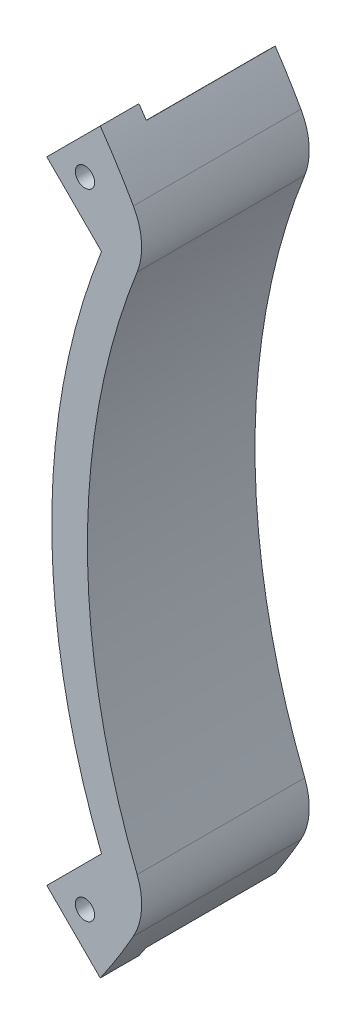
ISO-10303-21;
HEADER;
FILE_DESCRIPTION(('STEP AP214'),'2;1');
FILE_NAME('part.step','',(''),(''),'','','');
FILE_SCHEMA(('AUTOMOTIVE_DESIGN { 1 0 10303 214 1 1 1 1 }'));
ENDSEC;
DATA;
#1=APPLICATION_CONTEXT('core data for automotive mechanical design processes');
#2=APPLICATION_PROTOCOL_DEFINITION('international standard','automotive_design',2000,#1);
#3=PRODUCT_CONTEXT('',#1,'mechanical');
#4=PRODUCT('Part','Part','',(#3));
#5=PRODUCT_RELATED_PRODUCT_CATEGORY('part','',(#4));
#6=PRODUCT_DEFINITION_FORMATION('','',#4);
#7=PRODUCT_DEFINITION_CONTEXT('part definition',#1,'design');
#8=PRODUCT_DEFINITION('design','',#6,#7);
#9=PRODUCT_DEFINITION_SHAPE('','',#8);
#10=(LENGTH_UNIT() NAMED_UNIT(*) SI_UNIT(.MILLI.,.METRE.));
#11=(NAMED_UNIT(*) PLANE_ANGLE_UNIT() SI_UNIT($,.RADIAN.));
#12=(NAMED_UNIT(*) SI_UNIT($,.STERADIAN.) SOLID_ANGLE_UNIT());
#13=UNCERTAINTY_MEASURE_WITH_UNIT(LENGTH_MEASURE(1.E-05),#10,'distance_accuracy_value','');
#14=(GEOMETRIC_REPRESENTATION_CONTEXT(3) GLOBAL_UNCERTAINTY_ASSIGNED_CONTEXT((#13)) GLOBAL_UNIT_ASSIGNED_CONTEXT((#10,
#11,#12)) REPRESENTATION_CONTEXT('',''));
#15=CARTESIAN_POINT('',(0.,0.,0.));
#16=DIRECTION('',(0.,0.,1.));
#17=DIRECTION('',(1.,0.,0.));
#18=AXIS2_PLACEMENT_3D('',#15,#16,#17);
#19=CARTESIAN_POINT('',(175.870830597952,0.,-23.));
#20=DIRECTION('',(0.,0.,1.));
#21=DIRECTION('',(1.,0.,0.));
#22=AXIS2_PLACEMENT_3D('',#19,#20,#21);
#23=CYLINDRICAL_SURFACE('',#22,101.398788204074);
#24=DIRECTION('',(0.,0.,1.));
#25=VECTOR('',#24,1.);
#26=CARTESIAN_POINT('',(86.4700479418291,47.8457344987754,-23.));
#27=LINE('',#26,#25);
#28=CARTESIAN_POINT('',(86.4700479418291,47.8457344987754,-23.));
#29=VERTEX_POINT('',#28);
#30=CARTESIAN_POINT('',(86.4700479418291,47.8457344987754,0.));
#31=VERTEX_POINT('',#30);
#32=EDGE_CURVE('E209',#29,#31,#27,.T.);
#33=ORIENTED_EDGE('',*,*,#32,.F.);
#34=CARTESIAN_POINT('',(175.870830597952,0.,-23.));
#35=DIRECTION('',(0.,0.,-1.));
#36=DIRECTION('',(1.,0.,0.));
#37=AXIS2_PLACEMENT_3D('',#34,#35,#36);
#38=CIRCLE('',#37,101.398788204074);
#39=CARTESIAN_POINT('',(86.4700479418276,-47.8457344987727,-23.));
#40=VERTEX_POINT('',#39);
#41=EDGE_CURVE('E272',#40,#29,#38,.T.);
#42=ORIENTED_EDGE('',*,*,#41,.F.);
#43=DIRECTION('',(0.,0.,1.));
#44=VECTOR('',#43,1.);
#45=CARTESIAN_POINT('',(86.4700479418291,-47.8457344987754,-23.));
#46=LINE('',#45,#44);
#47=CARTESIAN_POINT('',(86.4700479418291,-47.8457344987754,0.));
#48=VERTEX_POINT('',#47);
#49=EDGE_CURVE('E227',#40,#48,#46,.T.);
#50=ORIENTED_EDGE('',*,*,#49,.T.);
#51=CARTESIAN_POINT('',(175.870830597952,0.,0.));
#52=DIRECTION('',(0.,0.,-1.));
#53=DIRECTION('',(1.,0.,0.));
#54=AXIS2_PLACEMENT_3D('',#51,#52,#53);
#55=CIRCLE('',#54,101.398788204074);
#56=CARTESIAN_POINT('',(74.4720423938781,9.73033553650936E-11,0.));
#57=VERTEX_POINT('',#56);
#58=EDGE_CURVE('E226',#48,#57,#55,.T.);
#59=ORIENTED_EDGE('',*,*,#58,.T.);
#60=EDGE_CURVE('E11',#57,#31,#55,.T.);
#61=ORIENTED_EDGE('',*,*,#60,.T.);
#62=EDGE_LOOP('',(#33,#42,#50,#59,#61));
#63=FACE_BOUND('',#62,.T.);
#64=ADVANCED_FACE('F35',(#63),#23,.T.);
#65=CARTESIAN_POINT('',(134.210526315791,22.0801862772663,-23.));
#66=DIRECTION('',(0.,0.,-1.));
#67=DIRECTION('',(-1.,0.,0.));
#68=AXIS2_PLACEMENT_3D('',#65,#66,#67);
#69=PLANE('',#68);
#70=DIRECTION('',(0.700426807828458,-0.71372423727602,0.));
#71=VECTOR('',#70,1.);
#72=CARTESIAN_POINT('',(83.1207639065787,-55.596210370733,-23.));
#73=LINE('',#72,#71);
#74=CARTESIAN_POINT('',(81.7680047254731,-54.217769391659,-23.));
#75=VERTEX_POINT('',#74);
#76=CARTESIAN_POINT('',(83.1207639065787,-55.596210370733,-23.));
#77=VERTEX_POINT('',#76);
#78=EDGE_CURVE('E200',#75,#77,#73,.T.);
#79=ORIENTED_EDGE('',*,*,#78,.F.);
#80=DIRECTION('',(0.593760298507402,0.804641974990369,0.));
#81=VECTOR('',#80,1.);
#82=CARTESIAN_POINT('',(80.5784912959711,-55.8297539544509,-23.));
#83=LINE('',#82,#81);
#84=EDGE_CURVE('E183',#75,#40,#83,.T.);
#85=ORIENTED_EDGE('',*,*,#84,.T.);
#86=ORIENTED_EDGE('',*,*,#41,.T.);
#87=DIRECTION('',(-0.593760298508029,0.804641974989906,0.));
#88=VECTOR('',#87,1.);
#89=CARTESIAN_POINT('',(80.5784912959711,55.8297539544379,-23.));
#90=LINE('',#89,#88);
#91=CARTESIAN_POINT('',(81.7680047254731,54.2177693916496,-23.));
#92=VERTEX_POINT('',#91);
#93=EDGE_CURVE('E210',#29,#92,#90,.T.);
#94=ORIENTED_EDGE('',*,*,#93,.T.);
#95=DIRECTION('',(-0.713724237276011,-0.700426807828467,0.));
#96=VECTOR('',#95,1.);
#97=CARTESIAN_POINT('',(81.7680047254731,54.2177693916496,-23.));
#98=LINE('',#97,#96);
#99=CARTESIAN_POINT('',(83.1413065624282,55.565485178232,-23.));
#100=VERTEX_POINT('',#99);
#101=EDGE_CURVE('E191',#100,#92,#98,.T.);
#102=ORIENTED_EDGE('',*,*,#101,.F.);
#103=CARTESIAN_POINT('',(-9.12325770485722E-11,-5.72528136011385E-11,-23.));
#104=DIRECTION('',(0.,0.,-1.));
#105=DIRECTION('',(-1.,0.,0.));
#106=AXIS2_PLACEMENT_3D('',#103,#104,#105);
#107=CIRCLE('',#106,100.000000000108);
#108=CARTESIAN_POINT('',(87.1345029239766,49.0670806161475,-23.));
#109=VERTEX_POINT('',#108);
#110=EDGE_CURVE('E39',#100,#109,#107,.T.);
#111=ORIENTED_EDGE('',*,*,#110,.T.);
#112=CARTESIAN_POINT('',(78.4210526315789,44.1603725545327,-23.));
#113=DIRECTION('',(0.,0.,-1.));
#114=DIRECTION('',(-1.,0.,0.));
#115=AXIS2_PLACEMENT_3D('',#112,#113,#114);
#116=CIRCLE('',#115,10.);
#117=CARTESIAN_POINT('',(87.719298245614,40.4803415083216,-23.));
#118=VERTEX_POINT('',#117);
#119=EDGE_CURVE('E247',#109,#118,#116,.T.);
#120=ORIENTED_EDGE('',*,*,#119,.T.);
#121=CARTESIAN_POINT('',(190.000000000003,0.,-23.));
#122=DIRECTION('',(0.,0.,1.));
#123=DIRECTION('',(-1.,0.,0.));
#124=AXIS2_PLACEMENT_3D('',#121,#122,#123);
#125=CIRCLE('',#124,110.000000000002);
#126=CARTESIAN_POINT('',(87.719298245614,-40.4803415083217,-23.));
#127=VERTEX_POINT('',#126);
#128=EDGE_CURVE('E242',#118,#127,#125,.T.);
#129=ORIENTED_EDGE('',*,*,#128,.T.);
#130=CARTESIAN_POINT('',(78.421052631579,-44.1603725545327,-23.));
#131=DIRECTION('',(0.,0.,-1.));
#132=DIRECTION('',(-1.,0.,0.));
#133=AXIS2_PLACEMENT_3D('',#130,#131,#132);
#134=CIRCLE('',#133,9.99999999999997);
#135=CARTESIAN_POINT('',(87.1345029239766,-49.0670806161475,-23.));
#136=VERTEX_POINT('',#135);
#137=EDGE_CURVE('E269',#127,#136,#134,.T.);
#138=ORIENTED_EDGE('',*,*,#137,.T.);
#139=CARTESIAN_POINT('',(-6.06875660835726E-11,3.8143099789778E-11,-23.));
#140=DIRECTION('',(0.,0.,-1.));
#141=DIRECTION('',(-1.,0.,0.));
#142=AXIS2_PLACEMENT_3D('',#139,#140,#141);
#143=CIRCLE('',#142,100.000000000072);
#144=EDGE_CURVE('E229',#136,#77,#143,.T.);
#145=ORIENTED_EDGE('',*,*,#144,.T.);
#146=EDGE_LOOP('',(#79,#85,#86,#94,#102,#111,#120,#129,#138,#145));
#147=FACE_BOUND('',#146,.T.);
#148=ADVANCED_FACE('F393',(#147),#69,.T.);
#149=CARTESIAN_POINT('',(0.,0.,0.));
#150=DIRECTION('',(0.,0.,1.));
#151=DIRECTION('',(1.,0.,0.));
#152=AXIS2_PLACEMENT_3D('',#149,#150,#151);
#153=PLANE('',#152);
#154=CARTESIAN_POINT('',(79.6200140237975,49.2144224327723,0.));
#155=DIRECTION('',(0.,0.,-1.));
#156=DIRECTION('',(-1.,0.,0.));
#157=AXIS2_PLACEMENT_3D('',#154,#155,#156);
#158=CIRCLE('',#157,1.5);
#159=CARTESIAN_POINT('',(78.1200140237975,49.2144224327723,0.));
#160=VERTEX_POINT('',#159);
#161=EDGE_CURVE('E275',#160,#160,#158,.T.);
#162=ORIENTED_EDGE('',*,*,#161,.F.);
#163=EDGE_LOOP('',(#162));
#164=FACE_BOUND('',#163,.T.);
#165=DIRECTION('',(-0.593760298508029,0.804641974989906,0.));
#166=VECTOR('',#165,1.);
#167=CARTESIAN_POINT('',(80.5784912959711,55.8297539544379,0.));
#168=LINE('',#167,#166);
#169=CARTESIAN_POINT('',(80.5784912959711,55.8297539544379,0.));
#170=VERTEX_POINT('',#169);
#171=EDGE_CURVE('E206',#31,#170,#168,.T.);
#172=ORIENTED_EDGE('',*,*,#171,.F.);
#173=ORIENTED_EDGE('',*,*,#60,.F.);
#174=CARTESIAN_POINT('',(184.472042393878,-8.25381429869765E-12,0.));
#175=DIRECTION('',(0.,0.,1.));
#176=DIRECTION('',(1.,0.,0.));
#177=AXIS2_PLACEMENT_3D('',#174,#175,#176);
#178=CIRCLE('',#177,110.);
#179=CARTESIAN_POINT('',(82.1859051286103,40.466605038601,0.));
#180=VERTEX_POINT('',#179);
#181=EDGE_CURVE('E287',#180,#57,#178,.T.);
#182=ORIENTED_EDGE('',*,*,#181,.F.);
#183=DIRECTION('',(0.707106781186502,-0.707106781186594,0.));
#184=VECTOR('',#183,1.);
#185=CARTESIAN_POINT('',(61.326255083611,61.326255083603,0.));
#186=LINE('',#185,#184);
#187=CARTESIAN_POINT('',(73.7006237543726,48.9518864128398,0.));
#188=VERTEX_POINT('',#187);
#189=EDGE_CURVE('E290',#188,#180,#186,.T.);
#190=ORIENTED_EDGE('',*,*,#189,.F.);
#191=DIRECTION('',(0.707106781186568,0.707106781186527,0.));
#192=VECTOR('',#191,1.);
#193=CARTESIAN_POINT('',(12.3743686707643,-12.374368670765,0.));
#194=LINE('',#193,#192);
#195=EDGE_CURVE('E339',#188,#170,#194,.T.);
#196=ORIENTED_EDGE('',*,*,#195,.T.);
#197=EDGE_LOOP('',(#172,#173,#182,#190,#196));
#198=FACE_BOUND('',#197,.T.);
#199=ADVANCED_FACE('F406',(#164,#198),#153,.F.);
#200=CARTESIAN_POINT('',(79.6191075128986,-49.2135159218862,0.));
#201=DIRECTION('',(0.,0.,-1.));
#202=DIRECTION('',(-1.,0.,0.));
#203=AXIS2_PLACEMENT_3D('',#200,#201,#202);
#204=CIRCLE('',#203,1.5);
#205=CARTESIAN_POINT('',(78.1191075128986,-49.2135159218862,0.));
#206=VERTEX_POINT('',#205);
#207=EDGE_CURVE('E284',#206,#206,#204,.T.);
#208=ORIENTED_EDGE('',*,*,#207,.F.);
#209=EDGE_LOOP('',(#208));
#210=FACE_BOUND('',#209,.T.);
#211=DIRECTION('',(0.593760298507402,0.804641974990369,0.));
#212=VECTOR('',#211,1.);
#213=CARTESIAN_POINT('',(80.5784912959711,-55.8297539544509,0.));
#214=LINE('',#213,#212);
#215=CARTESIAN_POINT('',(80.5784912959711,-55.8297539544509,0.));
#216=VERTEX_POINT('',#215);
#217=EDGE_CURVE('E212',#216,#48,#214,.T.);
#218=ORIENTED_EDGE('',*,*,#217,.F.);
#219=DIRECTION('',(-0.707106781186501,0.707106781186594,0.));
#220=VECTOR('',#219,1.);
#221=CARTESIAN_POINT('',(12.3743686707654,12.3743686707638,0.));
#222=LINE('',#221,#220);
#223=CARTESIAN_POINT('',(73.7006237543677,-48.9518864128466,0.));
#224=VERTEX_POINT('',#223);
#225=EDGE_CURVE('E45',#216,#224,#222,.T.);
#226=ORIENTED_EDGE('',*,*,#225,.T.);
#227=DIRECTION('',(0.707106781186594,0.707106781186501,0.));
#228=VECTOR('',#227,1.);
#229=CARTESIAN_POINT('',(61.3262550836023,-61.3262550836104,0.));
#230=LINE('',#229,#228);
#231=CARTESIAN_POINT('',(82.1859051286068,-40.4666050386086,0.));
#232=VERTEX_POINT('',#231);
#233=EDGE_CURVE('E293',#224,#232,#230,.T.);
#234=ORIENTED_EDGE('',*,*,#233,.T.);
#235=EDGE_CURVE('E291',#57,#232,#178,.T.);
#236=ORIENTED_EDGE('',*,*,#235,.F.);
#237=ORIENTED_EDGE('',*,*,#58,.F.);
#238=EDGE_LOOP('',(#218,#226,#234,#236,#237));
#239=FACE_BOUND('',#238,.T.);
#240=ADVANCED_FACE('F411',(#210,#239),#153,.F.);
#241=CARTESIAN_POINT('',(83.0850467894215,58.3363094478882,-7.));
#242=DIRECTION('',(0.707106781186527,-0.707106781186568,0.));
#243=DIRECTION('',(0.707106781186568,0.707106781186527,0.));
#244=AXIS2_PLACEMENT_3D('',#241,#242,#243);
#245=PLANE('',#244);
#246=DIRECTION('',(0.,0.,-1.));
#247=VECTOR('',#246,1.);
#248=CARTESIAN_POINT('',(81.9938702489879,57.2451329074546,3.));
#249=LINE('',#248,#247);
#250=CARTESIAN_POINT('',(81.9938702489879,57.2451329074546,-3.));
#251=VERTEX_POINT('',#250);
#252=CARTESIAN_POINT('',(81.9938702489879,57.2451329074546,3.));
#253=VERTEX_POINT('',#252);
#254=EDGE_CURVE('E320',#251,#253,#249,.F.);
#255=ORIENTED_EDGE('',*,*,#254,.F.);
#256=DIRECTION('',(0.707106781186568,0.707106781186527,0.));
#257=VECTOR('',#256,1.);
#258=CARTESIAN_POINT('',(80.5784912959711,55.8297539544379,-3.));
#259=LINE('',#258,#257);
#260=CARTESIAN_POINT('',(80.5784912959711,55.8297539544379,-3.));
#261=VERTEX_POINT('',#260);
#262=EDGE_CURVE('E189',#261,#251,#259,.T.);
#263=ORIENTED_EDGE('',*,*,#262,.F.);
#264=DIRECTION('',(0.,0.,1.));
#265=VECTOR('',#264,1.);
#266=CARTESIAN_POINT('',(80.5784912959711,55.8297539544379,-23.));
#267=LINE('',#266,#265);
#268=EDGE_CURVE('E207',#261,#170,#267,.T.);
#269=ORIENTED_EDGE('',*,*,#268,.T.);
#270=ORIENTED_EDGE('',*,*,#195,.F.);
#271=DIRECTION('',(0.,0.,1.));
#272=VECTOR('',#271,1.);
#273=CARTESIAN_POINT('',(73.7006237543726,48.9518864128398,0.));
#274=LINE('',#273,#272);
#275=CARTESIAN_POINT('',(73.7006237543726,48.9518864128398,3.));
#276=VERTEX_POINT('',#275);
#277=EDGE_CURVE('E311',#188,#276,#274,.T.);
#278=ORIENTED_EDGE('',*,*,#277,.T.);
#279=DIRECTION('',(0.707106781186568,0.707106781186527,0.));
#280=VECTOR('',#279,1.);
#281=CARTESIAN_POINT('',(83.0850467894215,58.3363094478882,3.));
#282=LINE('',#281,#280);
#283=EDGE_CURVE('E308',#276,#253,#282,.T.);
#284=ORIENTED_EDGE('',*,*,#283,.T.);
#285=EDGE_LOOP('',(#255,#263,#269,#270,#278,#284));
#286=FACE_BOUND('',#285,.T.);
#287=ADVANCED_FACE('F374',(#286),#245,.F.);
#288=CARTESIAN_POINT('',(0.,0.,3.));
#289=DIRECTION('',(0.,0.,-1.));
#290=DIRECTION('',(-1.,0.,0.));
#291=AXIS2_PLACEMENT_3D('',#288,#289,#290);
#292=CYLINDRICAL_SURFACE('',#291,100.);
#293=CARTESIAN_POINT('',(0.,0.,-3.));
#294=DIRECTION('',(0.,0.,1.));
#295=DIRECTION('',(1.,0.,0.));
#296=AXIS2_PLACEMENT_3D('',#293,#294,#295);
#297=CIRCLE('',#296,100.);
#298=CARTESIAN_POINT('',(81.9938702489824,-57.2451329074624,-3.));
#299=VERTEX_POINT('',#298);
#300=CARTESIAN_POINT('',(83.1207639065787,-55.596210370733,-3.));
#301=VERTEX_POINT('',#300);
#302=EDGE_CURVE('E204',#299,#301,#297,.T.);
#303=ORIENTED_EDGE('',*,*,#302,.T.);
#304=DIRECTION('',(0.,0.,-1.));
#305=VECTOR('',#304,1.);
#306=CARTESIAN_POINT('',(83.1207639065787,-55.596210370733,-3.));
#307=LINE('',#306,#305);
#308=EDGE_CURVE('E172',#301,#77,#307,.T.);
#309=ORIENTED_EDGE('',*,*,#308,.T.);
#310=ORIENTED_EDGE('',*,*,#144,.F.);
#311=DIRECTION('',(0.,0.,-1.));
#312=VECTOR('',#311,1.);
#313=CARTESIAN_POINT('',(87.1345029239766,-49.0670806161475,3.));
#314=LINE('',#313,#312);
#315=CARTESIAN_POINT('',(87.1345029239766,-49.0670806161475,3.));
#316=VERTEX_POINT('',#315);
#317=EDGE_CURVE('E254',#136,#316,#314,.F.);
#318=ORIENTED_EDGE('',*,*,#317,.T.);
#319=CARTESIAN_POINT('',(0.,0.,3.));
#320=DIRECTION('',(0.,0.,1.));
#321=DIRECTION('',(1.,0.,0.));
#322=AXIS2_PLACEMENT_3D('',#319,#320,#321);
#323=CIRCLE('',#322,100.);
#324=CARTESIAN_POINT('',(81.9938702489824,-57.2451329074624,3.));
#325=VERTEX_POINT('',#324);
#326=EDGE_CURVE('E328',#325,#316,#323,.T.);
#327=ORIENTED_EDGE('',*,*,#326,.F.);
#328=DIRECTION('',(0.,0.,-1.));
#329=VECTOR('',#328,1.);
#330=CARTESIAN_POINT('',(81.9938702489824,-57.2451329074624,3.));
#331=LINE('',#330,#329);
#332=EDGE_CURVE('E322',#325,#299,#331,.T.);
#333=ORIENTED_EDGE('',*,*,#332,.T.);
#334=EDGE_LOOP('',(#303,#309,#310,#318,#327,#333));
#335=FACE_BOUND('',#334,.T.);
#336=ADVANCED_FACE('F346',(#335),#292,.T.);
#337=ORIENTED_EDGE('',*,*,#110,.F.);
#338=DIRECTION('',(0.,0.,-1.));
#339=VECTOR('',#338,1.);
#340=CARTESIAN_POINT('',(83.1413065624282,55.565485178232,-3.));
#341=LINE('',#340,#339);
#342=CARTESIAN_POINT('',(83.1413065624282,55.565485178232,-3.));
#343=VERTEX_POINT('',#342);
#344=EDGE_CURVE('E195',#343,#100,#341,.T.);
#345=ORIENTED_EDGE('',*,*,#344,.F.);
#346=CARTESIAN_POINT('',(0.,0.,-3.));
#347=DIRECTION('',(0.,0.,1.));
#348=DIRECTION('',(1.,0.,0.));
#349=AXIS2_PLACEMENT_3D('',#346,#347,#348);
#350=CIRCLE('',#349,100.);
#351=EDGE_CURVE('E185',#343,#251,#350,.T.);
#352=ORIENTED_EDGE('',*,*,#351,.T.);
#353=ORIENTED_EDGE('',*,*,#254,.T.);
#354=CARTESIAN_POINT('',(87.1345029239766,49.0670806161475,3.));
#355=VERTEX_POINT('',#354);
#356=EDGE_CURVE('E255',#355,#253,#323,.T.);
#357=ORIENTED_EDGE('',*,*,#356,.F.);
#358=DIRECTION('',(0.,0.,-1.));
#359=VECTOR('',#358,1.);
#360=CARTESIAN_POINT('',(87.1345029239766,49.0670806161475,3.));
#361=LINE('',#360,#359);
#362=EDGE_CURVE('E252',#355,#109,#361,.T.);
#363=ORIENTED_EDGE('',*,*,#362,.T.);
#364=EDGE_LOOP('',(#337,#345,#352,#353,#357,#363));
#365=FACE_BOUND('',#364,.T.);
#366=ADVANCED_FACE('F369',(#365),#292,.T.);
#367=CARTESIAN_POINT('',(0.,0.,3.));
#368=DIRECTION('',(0.,0.,1.));
#369=DIRECTION('',(1.,0.,0.));
#370=AXIS2_PLACEMENT_3D('',#367,#368,#369);
#371=PLANE('',#370);
#372=CARTESIAN_POINT('',(79.6191075128986,-49.2135159218862,3.));
#373=DIRECTION('',(0.,0.,-1.));
#374=DIRECTION('',(-1.,0.,0.));
#375=AXIS2_PLACEMENT_3D('',#372,#373,#374);
#376=CIRCLE('',#375,1.5);
#377=CARTESIAN_POINT('',(78.1191075128986,-49.2135159218862,3.));
#378=VERTEX_POINT('',#377);
#379=EDGE_CURVE('E261',#378,#378,#376,.T.);
#380=ORIENTED_EDGE('',*,*,#379,.T.);
#381=EDGE_LOOP('',(#380));
#382=FACE_BOUND('',#381,.T.);
#383=CARTESIAN_POINT('',(79.6200140237975,49.2144224327723,3.));
#384=DIRECTION('',(0.,0.,-1.));
#385=DIRECTION('',(-1.,0.,0.));
#386=AXIS2_PLACEMENT_3D('',#383,#384,#385);
#387=CIRCLE('',#386,1.5);
#388=CARTESIAN_POINT('',(78.1200140237975,49.2144224327723,3.));
#389=VERTEX_POINT('',#388);
#390=EDGE_CURVE('E279',#389,#389,#387,.T.);
#391=ORIENTED_EDGE('',*,*,#390,.T.);
#392=EDGE_LOOP('',(#391));
#393=FACE_BOUND('',#392,.T.);
#394=DIRECTION('',(0.707106781186594,0.707106781186501,0.));
#395=VECTOR('',#394,1.);
#396=CARTESIAN_POINT('',(61.3262550836023,-61.3262550836104,3.));
#397=LINE('',#396,#395);
#398=CARTESIAN_POINT('',(73.7006237543677,-48.9518864128466,3.));
#399=VERTEX_POINT('',#398);
#400=CARTESIAN_POINT('',(82.1859051286068,-40.4666050386086,3.));
#401=VERTEX_POINT('',#400);
#402=EDGE_CURVE('E303',#399,#401,#397,.T.);
#403=ORIENTED_EDGE('',*,*,#402,.F.);
#404=DIRECTION('',(-0.707106781186501,0.707106781186594,0.));
#405=VECTOR('',#404,1.);
#406=CARTESIAN_POINT('',(83.0850467894155,-58.3363094478957,3.));
#407=LINE('',#406,#405);
#408=EDGE_CURVE('E317',#325,#399,#407,.T.);
#409=ORIENTED_EDGE('',*,*,#408,.F.);
#410=ORIENTED_EDGE('',*,*,#326,.T.);
#411=CARTESIAN_POINT('',(78.4210526315789,-44.1603725545327,3.));
#412=DIRECTION('',(0.,0.,1.));
#413=DIRECTION('',(1.,0.,0.));
#414=AXIS2_PLACEMENT_3D('',#411,#412,#413);
#415=CIRCLE('',#414,10.);
#416=CARTESIAN_POINT('',(87.719298245614,-40.4803415083217,3.));
#417=VERTEX_POINT('',#416);
#418=EDGE_CURVE('E333',#316,#417,#415,.T.);
#419=ORIENTED_EDGE('',*,*,#418,.T.);
#420=CARTESIAN_POINT('',(190.,0.,3.));
#421=DIRECTION('',(0.,0.,1.));
#422=DIRECTION('',(1.,0.,0.));
#423=AXIS2_PLACEMENT_3D('',#420,#421,#422);
#424=CIRCLE('',#423,110.);
#425=CARTESIAN_POINT('',(87.719298245614,40.4803415083217,3.));
#426=VERTEX_POINT('',#425);
#427=EDGE_CURVE('E325',#426,#417,#424,.T.);
#428=ORIENTED_EDGE('',*,*,#427,.F.);
#429=CARTESIAN_POINT('',(78.4210526315789,44.1603725545327,3.));
#430=DIRECTION('',(0.,0.,1.));
#431=DIRECTION('',(1.,0.,0.));
#432=AXIS2_PLACEMENT_3D('',#429,#430,#431);
#433=CIRCLE('',#432,10.);
#434=EDGE_CURVE('E331',#426,#355,#433,.T.);
#435=ORIENTED_EDGE('',*,*,#434,.T.);
#436=ORIENTED_EDGE('',*,*,#356,.T.);
#437=ORIENTED_EDGE('',*,*,#283,.F.);
#438=DIRECTION('',(0.707106781186502,-0.707106781186594,0.));
#439=VECTOR('',#438,1.);
#440=CARTESIAN_POINT('',(61.326255083611,61.326255083603,3.));
#441=LINE('',#440,#439);
#442=CARTESIAN_POINT('',(82.1859051286103,40.466605038601,3.));
#443=VERTEX_POINT('',#442);
#444=EDGE_CURVE('E300',#276,#443,#441,.T.);
#445=ORIENTED_EDGE('',*,*,#444,.T.);
#446=CARTESIAN_POINT('',(184.472042393878,-8.25381429869765E-12,3.));
#447=DIRECTION('',(0.,0.,1.));
#448=DIRECTION('',(1.,0.,0.));
#449=AXIS2_PLACEMENT_3D('',#446,#447,#448);
#450=CIRCLE('',#449,110.);
#451=EDGE_CURVE('E297',#443,#401,#450,.T.);
#452=ORIENTED_EDGE('',*,*,#451,.T.);
#453=EDGE_LOOP('',(#403,#409,#410,#419,#428,#435,#436,#437,#445,#452));
#454=FACE_BOUND('',#453,.T.);
#455=ADVANCED_FACE('F355',(#382,#393,#454),#371,.T.);
#456=CARTESIAN_POINT('',(190.,0.,0.));
#457=DIRECTION('',(0.,0.,1.));
#458=DIRECTION('',(1.,0.,0.));
#459=AXIS2_PLACEMENT_3D('',#456,#457,#458);
#460=CYLINDRICAL_SURFACE('',#459,110.);
#461=ORIENTED_EDGE('',*,*,#427,.T.);
#462=DIRECTION('',(0.,0.,1.));
#463=VECTOR('',#462,1.);
#464=CARTESIAN_POINT('',(87.719298245614,-40.4803415083217,0.));
#465=LINE('',#464,#463);
#466=EDGE_CURVE('E337',#417,#127,#465,.F.);
#467=ORIENTED_EDGE('',*,*,#466,.T.);
#468=ORIENTED_EDGE('',*,*,#128,.F.);
#469=DIRECTION('',(0.,0.,1.));
#470=VECTOR('',#469,1.);
#471=CARTESIAN_POINT('',(87.719298245614,40.4803415083217,0.));
#472=LINE('',#471,#470);
#473=EDGE_CURVE('E335',#118,#426,#472,.T.);
#474=ORIENTED_EDGE('',*,*,#473,.T.);
#475=EDGE_LOOP('',(#461,#467,#468,#474));
#476=FACE_BOUND('',#475,.T.);
#477=ADVANCED_FACE('F359',(#476),#460,.F.);
#478=CARTESIAN_POINT('',(78.4210526315789,-44.1603725545327,0.));
#479=DIRECTION('',(0.,0.,-1.));
#480=DIRECTION('',(-1.,0.,0.));
#481=AXIS2_PLACEMENT_3D('',#478,#479,#480);
#482=CYLINDRICAL_SURFACE('',#481,10.);
#483=ORIENTED_EDGE('',*,*,#317,.F.);
#484=ORIENTED_EDGE('',*,*,#137,.F.);
#485=ORIENTED_EDGE('',*,*,#466,.F.);
#486=ORIENTED_EDGE('',*,*,#418,.F.);
#487=EDGE_LOOP('',(#483,#484,#485,#486));
#488=FACE_BOUND('',#487,.T.);
#489=ADVANCED_FACE('F350',(#488),#482,.T.);
#490=CARTESIAN_POINT('',(78.4210526315789,44.1603725545327,0.));
#491=DIRECTION('',(0.,0.,1.));
#492=DIRECTION('',(1.,0.,0.));
#493=AXIS2_PLACEMENT_3D('',#490,#491,#492);
#494=CYLINDRICAL_SURFACE('',#493,10.);
#495=ORIENTED_EDGE('',*,*,#434,.F.);
#496=ORIENTED_EDGE('',*,*,#473,.F.);
#497=ORIENTED_EDGE('',*,*,#119,.F.);
#498=ORIENTED_EDGE('',*,*,#362,.F.);
#499=EDGE_LOOP('',(#495,#496,#497,#498));
#500=FACE_BOUND('',#499,.T.);
#501=ADVANCED_FACE('F37',(#500),#494,.T.);
#502=CARTESIAN_POINT('',(83.0850467894155,-58.3363094478957,-7.));
#503=DIRECTION('',(0.707106781186594,0.707106781186501,0.));
#504=DIRECTION('',(-0.707106781186501,0.707106781186594,0.));
#505=AXIS2_PLACEMENT_3D('',#502,#503,#504);
#506=PLANE('',#505);
#507=DIRECTION('',(0.,0.,1.));
#508=VECTOR('',#507,1.);
#509=CARTESIAN_POINT('',(80.5784912959711,-55.8297539544509,-23.));
#510=LINE('',#509,#508);
#511=CARTESIAN_POINT('',(80.5784912959711,-55.8297539544509,-3.));
#512=VERTEX_POINT('',#511);
#513=EDGE_CURVE('E224',#512,#216,#510,.T.);
#514=ORIENTED_EDGE('',*,*,#513,.F.);
#515=DIRECTION('',(-0.707106781186501,0.707106781186594,0.));
#516=VECTOR('',#515,1.);
#517=CARTESIAN_POINT('',(81.9938702489824,-57.2451329074624,-3.));
#518=LINE('',#517,#516);
#519=EDGE_CURVE('E53',#299,#512,#518,.T.);
#520=ORIENTED_EDGE('',*,*,#519,.F.);
#521=ORIENTED_EDGE('',*,*,#332,.F.);
#522=ORIENTED_EDGE('',*,*,#408,.T.);
#523=DIRECTION('',(0.,0.,1.));
#524=VECTOR('',#523,1.);
#525=CARTESIAN_POINT('',(73.7006237543677,-48.9518864128466,0.));
#526=LINE('',#525,#524);
#527=EDGE_CURVE('E309',#224,#399,#526,.T.);
#528=ORIENTED_EDGE('',*,*,#527,.F.);
#529=ORIENTED_EDGE('',*,*,#225,.F.);
#530=EDGE_LOOP('',(#514,#520,#521,#522,#528,#529));
#531=FACE_BOUND('',#530,.T.);
#532=ADVANCED_FACE('F391',(#531),#506,.F.);
#533=CARTESIAN_POINT('',(184.472042393878,-8.25381429869765E-12,0.));
#534=DIRECTION('',(0.,0.,1.));
#535=DIRECTION('',(1.,0.,0.));
#536=AXIS2_PLACEMENT_3D('',#533,#534,#535);
#537=CYLINDRICAL_SURFACE('',#536,110.);
#538=ORIENTED_EDGE('',*,*,#451,.F.);
#539=DIRECTION('',(0.,0.,1.));
#540=VECTOR('',#539,1.);
#541=CARTESIAN_POINT('',(82.1859051286103,40.466605038601,0.));
#542=LINE('',#541,#540);
#543=EDGE_CURVE('E296',#180,#443,#542,.T.);
#544=ORIENTED_EDGE('',*,*,#543,.F.);
#545=ORIENTED_EDGE('',*,*,#181,.T.);
#546=ORIENTED_EDGE('',*,*,#235,.T.);
#547=DIRECTION('',(0.,0.,1.));
#548=VECTOR('',#547,1.);
#549=CARTESIAN_POINT('',(82.1859051286068,-40.4666050386086,0.));
#550=LINE('',#549,#548);
#551=EDGE_CURVE('E306',#232,#401,#550,.T.);
#552=ORIENTED_EDGE('',*,*,#551,.T.);
#553=EDGE_LOOP('',(#538,#544,#545,#546,#552));
#554=FACE_BOUND('',#553,.T.);
#555=ADVANCED_FACE('F383',(#554),#537,.T.);
#556=CARTESIAN_POINT('',(61.3262550836023,-61.3262550836104,0.));
#557=DIRECTION('',(0.707106781186501,-0.707106781186594,0.));
#558=DIRECTION('',(0.707106781186594,0.707106781186501,0.));
#559=AXIS2_PLACEMENT_3D('',#556,#557,#558);
#560=PLANE('',#559);
#561=ORIENTED_EDGE('',*,*,#402,.T.);
#562=ORIENTED_EDGE('',*,*,#551,.F.);
#563=ORIENTED_EDGE('',*,*,#233,.F.);
#564=ORIENTED_EDGE('',*,*,#527,.T.);
#565=EDGE_LOOP('',(#561,#562,#563,#564));
#566=FACE_BOUND('',#565,.T.);
#567=ADVANCED_FACE('F388',(#566),#560,.F.);
#568=CARTESIAN_POINT('',(61.326255083611,61.326255083603,0.));
#569=DIRECTION('',(-0.707106781186593,-0.707106781186501,0.));
#570=DIRECTION('',(0.707106781186502,-0.707106781186594,0.));
#571=AXIS2_PLACEMENT_3D('',#568,#569,#570);
#572=PLANE('',#571);
#573=ORIENTED_EDGE('',*,*,#444,.F.);
#574=ORIENTED_EDGE('',*,*,#277,.F.);
#575=ORIENTED_EDGE('',*,*,#189,.T.);
#576=ORIENTED_EDGE('',*,*,#543,.T.);
#577=EDGE_LOOP('',(#573,#574,#575,#576));
#578=FACE_BOUND('',#577,.T.);
#579=ADVANCED_FACE('F378',(#578),#572,.T.);
#580=CARTESIAN_POINT('',(79.6200140237975,49.2144224327723,3.));
#581=DIRECTION('',(0.,0.,-1.));
#582=DIRECTION('',(-1.,0.,0.));
#583=AXIS2_PLACEMENT_3D('',#580,#581,#582);
#584=CYLINDRICAL_SURFACE('',#583,1.5);
#585=ORIENTED_EDGE('',*,*,#390,.F.);
#586=EDGE_LOOP('',(#585));
#587=FACE_BOUND('',#586,.T.);
#588=ORIENTED_EDGE('',*,*,#161,.T.);
#589=EDGE_LOOP('',(#588));
#590=FACE_BOUND('',#589,.T.);
#591=ADVANCED_FACE('F423',(#587,#590),#584,.F.);
#592=CARTESIAN_POINT('',(79.6191075128986,-49.2135159218862,3.));
#593=DIRECTION('',(0.,0.,-1.));
#594=DIRECTION('',(-1.,0.,0.));
#595=AXIS2_PLACEMENT_3D('',#592,#593,#594);
#596=CYLINDRICAL_SURFACE('',#595,1.5);
#597=ORIENTED_EDGE('',*,*,#379,.F.);
#598=EDGE_LOOP('',(#597));
#599=FACE_BOUND('',#598,.T.);
#600=ORIENTED_EDGE('',*,*,#207,.T.);
#601=EDGE_LOOP('',(#600));
#602=FACE_BOUND('',#601,.T.);
#603=ADVANCED_FACE('F420',(#599,#602),#596,.F.);
#604=CARTESIAN_POINT('',(80.5784912959711,-55.8297539544509,-23.));
#605=DIRECTION('',(0.804641974990369,-0.593760298507402,0.));
#606=DIRECTION('',(0.593760298507402,0.804641974990369,0.));
#607=AXIS2_PLACEMENT_3D('',#604,#605,#606);
#608=PLANE('',#607);
#609=ORIENTED_EDGE('',*,*,#84,.F.);
#610=DIRECTION('',(0.,0.,-1.));
#611=VECTOR('',#610,1.);
#612=CARTESIAN_POINT('',(81.7680047254731,-54.217769391659,-3.));
#613=LINE('',#612,#611);
#614=CARTESIAN_POINT('',(81.7680047254731,-54.217769391659,-3.));
#615=VERTEX_POINT('',#614);
#616=EDGE_CURVE('E169',#615,#75,#613,.T.);
#617=ORIENTED_EDGE('',*,*,#616,.F.);
#618=DIRECTION('',(0.593760298507173,0.804641974990537,0.));
#619=VECTOR('',#618,1.);
#620=CARTESIAN_POINT('',(80.5784912959711,-55.8297539544509,-3.));
#621=LINE('',#620,#619);
#622=EDGE_CURVE('E174',#512,#615,#621,.T.);
#623=ORIENTED_EDGE('',*,*,#622,.F.);
#624=ORIENTED_EDGE('',*,*,#513,.T.);
#625=ORIENTED_EDGE('',*,*,#217,.T.);
#626=ORIENTED_EDGE('',*,*,#49,.F.);
#627=EDGE_LOOP('',(#609,#617,#623,#624,#625,#626));
#628=FACE_BOUND('',#627,.T.);
#629=ADVANCED_FACE('F181',(#628),#608,.F.);
#630=CARTESIAN_POINT('',(80.5784912959711,55.8297539544379,-23.));
#631=DIRECTION('',(0.804641974989906,0.593760298508029,0.));
#632=DIRECTION('',(-0.593760298508029,0.804641974989906,0.));
#633=AXIS2_PLACEMENT_3D('',#630,#631,#632);
#634=PLANE('',#633);
#635=DIRECTION('',(-0.593760298508031,0.804641974989904,0.));
#636=VECTOR('',#635,1.);
#637=CARTESIAN_POINT('',(80.5784912959711,55.8297539544379,-3.));
#638=LINE('',#637,#636);
#639=CARTESIAN_POINT('',(81.7680047254731,54.2177693916496,-3.));
#640=VERTEX_POINT('',#639);
#641=EDGE_CURVE('E193',#640,#261,#638,.T.);
#642=ORIENTED_EDGE('',*,*,#641,.F.);
#643=DIRECTION('',(0.,0.,-1.));
#644=VECTOR('',#643,1.);
#645=CARTESIAN_POINT('',(81.7680047254731,54.2177693916496,-3.));
#646=LINE('',#645,#644);
#647=EDGE_CURVE('E197',#640,#92,#646,.T.);
#648=ORIENTED_EDGE('',*,*,#647,.T.);
#649=ORIENTED_EDGE('',*,*,#93,.F.);
#650=ORIENTED_EDGE('',*,*,#32,.T.);
#651=ORIENTED_EDGE('',*,*,#171,.T.);
#652=ORIENTED_EDGE('',*,*,#268,.F.);
#653=EDGE_LOOP('',(#642,#648,#649,#650,#651,#652));
#654=FACE_BOUND('',#653,.T.);
#655=ADVANCED_FACE('F400',(#654),#634,.F.);
#656=CARTESIAN_POINT('',(81.7277645410967,55.8315908861232,-3.));
#657=DIRECTION('',(0.,0.,1.));
#658=DIRECTION('',(1.,0.,0.));
#659=AXIS2_PLACEMENT_3D('',#656,#657,#658);
#660=PLANE('',#659);
#661=DIRECTION('',(-0.713724237276011,-0.700426807828467,0.));
#662=VECTOR('',#661,1.);
#663=CARTESIAN_POINT('',(81.7680047254731,54.2177693916496,-3.));
#664=LINE('',#663,#662);
#665=EDGE_CURVE('E61',#343,#640,#664,.T.);
#666=ORIENTED_EDGE('',*,*,#665,.T.);
#667=ORIENTED_EDGE('',*,*,#641,.T.);
#668=ORIENTED_EDGE('',*,*,#262,.T.);
#669=ORIENTED_EDGE('',*,*,#351,.F.);
#670=EDGE_LOOP('',(#666,#667,#668,#669));
#671=FACE_BOUND('',#670,.T.);
#672=ADVANCED_FACE('F401',(#671),#660,.F.);
#673=CARTESIAN_POINT('',(81.7680047254731,54.2177693916496,-3.));
#674=DIRECTION('',(0.700426807828467,-0.713724237276011,0.));
#675=DIRECTION('',(0.713724237276011,0.700426807828467,0.));
#676=AXIS2_PLACEMENT_3D('',#673,#674,#675);
#677=PLANE('',#676);
#678=ORIENTED_EDGE('',*,*,#101,.T.);
#679=ORIENTED_EDGE('',*,*,#647,.F.);
#680=ORIENTED_EDGE('',*,*,#665,.F.);
#681=ORIENTED_EDGE('',*,*,#344,.T.);
#682=EDGE_LOOP('',(#678,#679,#680,#681));
#683=FACE_BOUND('',#682,.T.);
#684=ADVANCED_FACE('F396',(#683),#677,.F.);
#685=CARTESIAN_POINT('',(81.7328558094158,-55.8572248102996,-3.));
#686=DIRECTION('',(0.,0.,1.));
#687=DIRECTION('',(1.,0.,0.));
#688=AXIS2_PLACEMENT_3D('',#685,#686,#687);
#689=PLANE('',#688);
#690=ORIENTED_EDGE('',*,*,#519,.T.);
#691=ORIENTED_EDGE('',*,*,#622,.T.);
#692=DIRECTION('',(0.700426807828458,-0.71372423727602,0.));
#693=VECTOR('',#692,1.);
#694=CARTESIAN_POINT('',(83.1207639065787,-55.596210370733,-3.));
#695=LINE('',#694,#693);
#696=EDGE_CURVE('E166',#615,#301,#695,.T.);
#697=ORIENTED_EDGE('',*,*,#696,.T.);
#698=ORIENTED_EDGE('',*,*,#302,.F.);
#699=EDGE_LOOP('',(#690,#691,#697,#698));
#700=FACE_BOUND('',#699,.T.);
#701=ADVANCED_FACE('F176',(#700),#689,.F.);
#702=CARTESIAN_POINT('',(83.1207639065787,-55.596210370733,-3.));
#703=DIRECTION('',(0.71372423727602,0.700426807828458,0.));
#704=DIRECTION('',(-0.700426807828458,0.71372423727602,0.));
#705=AXIS2_PLACEMENT_3D('',#702,#703,#704);
#706=PLANE('',#705);
#707=ORIENTED_EDGE('',*,*,#78,.T.);
#708=ORIENTED_EDGE('',*,*,#308,.F.);
#709=ORIENTED_EDGE('',*,*,#696,.F.);
#710=ORIENTED_EDGE('',*,*,#616,.T.);
#711=EDGE_LOOP('',(#707,#708,#709,#710));
#712=FACE_BOUND('',#711,.T.);
#713=ADVANCED_FACE('F167',(#712),#706,.F.);
#714=CLOSED_SHELL('',(#64,#148,#199,#240,#287,#336,#366,#455,#477,#489,#501,#532,#555,#567,#579,
#591,#603,#629,#655,#672,#684,#701,#713));
#715=MANIFOLD_SOLID_BREP('B2',#714);
#716=ADVANCED_BREP_SHAPE_REPRESENTATION('',(#18,#715),#14);
#717=SHAPE_DEFINITION_REPRESENTATION(#9,#716);
ENDSEC;
END-ISO-10303-21;
